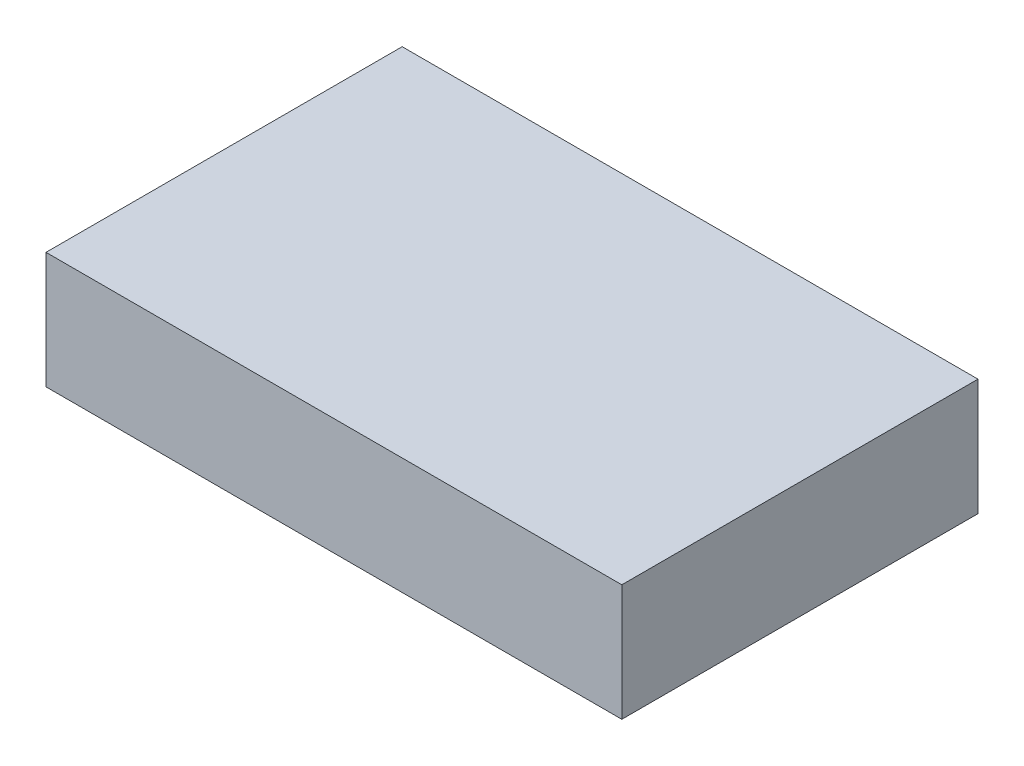
ISO-10303-21;
HEADER;
FILE_DESCRIPTION(('STEP AP214'),'2;1');
FILE_NAME('part.step','',(''),(''),'','','');
FILE_SCHEMA(('AUTOMOTIVE_DESIGN { 1 0 10303 214 1 1 1 1 }'));
ENDSEC;
DATA;
#1=APPLICATION_CONTEXT('core data for automotive mechanical design processes');
#2=APPLICATION_PROTOCOL_DEFINITION('international standard','automotive_design',2000,#1);
#3=PRODUCT_CONTEXT('',#1,'mechanical');
#4=PRODUCT('Part','Part','',(#3));
#5=PRODUCT_RELATED_PRODUCT_CATEGORY('part','',(#4));
#6=PRODUCT_DEFINITION_FORMATION('','',#4);
#7=PRODUCT_DEFINITION_CONTEXT('part definition',#1,'design');
#8=PRODUCT_DEFINITION('design','',#6,#7);
#9=PRODUCT_DEFINITION_SHAPE('','',#8);
#10=(LENGTH_UNIT() NAMED_UNIT(*) SI_UNIT(.MILLI.,.METRE.));
#11=(NAMED_UNIT(*) PLANE_ANGLE_UNIT() SI_UNIT($,.RADIAN.));
#12=(NAMED_UNIT(*) SI_UNIT($,.STERADIAN.) SOLID_ANGLE_UNIT());
#13=UNCERTAINTY_MEASURE_WITH_UNIT(LENGTH_MEASURE(1.E-05),#10,'distance_accuracy_value','');
#14=(GEOMETRIC_REPRESENTATION_CONTEXT(3) GLOBAL_UNCERTAINTY_ASSIGNED_CONTEXT((#13)) GLOBAL_UNIT_ASSIGNED_CONTEXT((#10,
#11,#12)) REPRESENTATION_CONTEXT('',''));
#15=CARTESIAN_POINT('',(0.,0.,0.));
#16=DIRECTION('',(0.,0.,1.));
#17=DIRECTION('',(1.,0.,0.));
#18=AXIS2_PLACEMENT_3D('',#15,#16,#17);
#19=CARTESIAN_POINT('',(0.,0.315,0.));
#20=DIRECTION('',(0.,1.,0.));
#21=DIRECTION('',(1.,0.,0.));
#22=AXIS2_PLACEMENT_3D('',#19,#20,#21);
#23=PLANE('',#22);
#24=DIRECTION('',(0.,0.,1.));
#25=VECTOR('',#24,1.);
#26=CARTESIAN_POINT('',(-0.06496203605977,0.315,-0.462376844896));
#27=LINE('',#26,#25);
#28=CARTESIAN_POINT('',(-0.06496203605977,0.315,-0.462376844896));
#29=VERTEX_POINT('',#28);
#30=CARTESIAN_POINT('',(-0.06496203605977,0.315,-0.156673145791));
#31=VERTEX_POINT('',#30);
#32=EDGE_CURVE('E97',#29,#31,#27,.T.);
#33=ORIENTED_EDGE('',*,*,#32,.F.);
#34=DIRECTION('',(-1.,0.,0.));
#35=VECTOR('',#34,1.);
#36=CARTESIAN_POINT('',(-0.06496203605977,0.315,-0.462376844896));
#37=LINE('',#36,#35);
#38=CARTESIAN_POINT('',(0.42925894416,0.315,-0.462376844896));
#39=VERTEX_POINT('',#38);
#40=EDGE_CURVE('E27',#39,#29,#37,.T.);
#41=ORIENTED_EDGE('',*,*,#40,.F.);
#42=DIRECTION('',(0.,0.,-1.));
#43=VECTOR('',#42,1.);
#44=CARTESIAN_POINT('',(0.42925894416,0.315,-0.462376844896));
#45=LINE('',#44,#43);
#46=CARTESIAN_POINT('',(0.42925894416,0.315,-0.156673145791));
#47=VERTEX_POINT('',#46);
#48=EDGE_CURVE('E73',#47,#39,#45,.T.);
#49=ORIENTED_EDGE('',*,*,#48,.F.);
#50=DIRECTION('',(1.,0.,0.));
#51=VECTOR('',#50,1.);
#52=CARTESIAN_POINT('',(-0.06496203605977,0.315,-0.156673145791));
#53=LINE('',#52,#51);
#54=EDGE_CURVE('E55',#31,#47,#53,.T.);
#55=ORIENTED_EDGE('',*,*,#54,.F.);
#56=EDGE_LOOP('',(#33,#41,#49,#55));
#57=FACE_BOUND('',#56,.T.);
#58=ADVANCED_FACE('F17',(#57),#23,.F.);
#59=CARTESIAN_POINT('',(0.,0.415,0.));
#60=DIRECTION('',(0.,1.,0.));
#61=DIRECTION('',(1.,0.,0.));
#62=AXIS2_PLACEMENT_3D('',#59,#60,#61);
#63=PLANE('',#62);
#64=DIRECTION('',(0.,0.,1.));
#65=VECTOR('',#64,1.);
#66=CARTESIAN_POINT('',(-0.06496203605977,0.415,-0.462376844896));
#67=LINE('',#66,#65);
#68=CARTESIAN_POINT('',(-0.06496203605977,0.415,-0.462376844896));
#69=VERTEX_POINT('',#68);
#70=CARTESIAN_POINT('',(-0.06496203605977,0.415,-0.156673145791));
#71=VERTEX_POINT('',#70);
#72=EDGE_CURVE('E20',#69,#71,#67,.T.);
#73=ORIENTED_EDGE('',*,*,#72,.T.);
#74=DIRECTION('',(1.,0.,0.));
#75=VECTOR('',#74,1.);
#76=CARTESIAN_POINT('',(-0.06496203605977,0.415,-0.156673145791));
#77=LINE('',#76,#75);
#78=CARTESIAN_POINT('',(0.42925894416,0.415,-0.156673145791));
#79=VERTEX_POINT('',#78);
#80=EDGE_CURVE('E107',#71,#79,#77,.T.);
#81=ORIENTED_EDGE('',*,*,#80,.T.);
#82=DIRECTION('',(0.,0.,-1.));
#83=VECTOR('',#82,1.);
#84=CARTESIAN_POINT('',(0.42925894416,0.415,-0.462376844896));
#85=LINE('',#84,#83);
#86=CARTESIAN_POINT('',(0.42925894416,0.415,-0.462376844896));
#87=VERTEX_POINT('',#86);
#88=EDGE_CURVE('E82',#79,#87,#85,.T.);
#89=ORIENTED_EDGE('',*,*,#88,.T.);
#90=DIRECTION('',(-1.,0.,0.));
#91=VECTOR('',#90,1.);
#92=CARTESIAN_POINT('',(-0.06496203605977,0.415,-0.462376844896));
#93=LINE('',#92,#91);
#94=EDGE_CURVE('E11',#87,#69,#93,.T.);
#95=ORIENTED_EDGE('',*,*,#94,.T.);
#96=EDGE_LOOP('',(#73,#81,#89,#95));
#97=FACE_BOUND('',#96,.T.);
#98=ADVANCED_FACE('F78',(#97),#63,.T.);
#99=CARTESIAN_POINT('',(-0.06496203605977,0.415,-0.462376844896));
#100=DIRECTION('',(0.,0.,1.));
#101=DIRECTION('',(1.,0.,0.));
#102=AXIS2_PLACEMENT_3D('',#99,#100,#101);
#103=PLANE('',#102);
#104=ORIENTED_EDGE('',*,*,#40,.T.);
#105=DIRECTION('',(0.,-1.,0.));
#106=VECTOR('',#105,1.);
#107=CARTESIAN_POINT('',(-0.06496203605977,0.415,-0.462376844896));
#108=LINE('',#107,#106);
#109=EDGE_CURVE('E84',#69,#29,#108,.T.);
#110=ORIENTED_EDGE('',*,*,#109,.F.);
#111=ORIENTED_EDGE('',*,*,#94,.F.);
#112=DIRECTION('',(0.,-1.,0.));
#113=VECTOR('',#112,1.);
#114=CARTESIAN_POINT('',(0.42925894416,0.415,-0.462376844896));
#115=LINE('',#114,#113);
#116=EDGE_CURVE('E110',#87,#39,#115,.T.);
#117=ORIENTED_EDGE('',*,*,#116,.T.);
#118=EDGE_LOOP('',(#104,#110,#111,#117));
#119=FACE_BOUND('',#118,.T.);
#120=ADVANCED_FACE('F85',(#119),#103,.F.);
#121=CARTESIAN_POINT('',(0.42925894416,0.415,-0.462376844896));
#122=DIRECTION('',(-1.,0.,0.));
#123=DIRECTION('',(0.,0.,1.));
#124=AXIS2_PLACEMENT_3D('',#121,#122,#123);
#125=PLANE('',#124);
#126=ORIENTED_EDGE('',*,*,#48,.T.);
#127=ORIENTED_EDGE('',*,*,#116,.F.);
#128=ORIENTED_EDGE('',*,*,#88,.F.);
#129=DIRECTION('',(0.,-1.,0.));
#130=VECTOR('',#129,1.);
#131=CARTESIAN_POINT('',(0.42925894416,0.415,-0.156673145791));
#132=LINE('',#131,#130);
#133=EDGE_CURVE('E105',#79,#47,#132,.T.);
#134=ORIENTED_EDGE('',*,*,#133,.T.);
#135=EDGE_LOOP('',(#126,#127,#128,#134));
#136=FACE_BOUND('',#135,.T.);
#137=ADVANCED_FACE('F120',(#136),#125,.F.);
#138=CARTESIAN_POINT('',(-0.06496203605977,0.415,-0.156673145791));
#139=DIRECTION('',(0.,0.,-1.));
#140=DIRECTION('',(0.,-1.,0.));
#141=AXIS2_PLACEMENT_3D('',#138,#139,#140);
#142=PLANE('',#141);
#143=ORIENTED_EDGE('',*,*,#54,.T.);
#144=ORIENTED_EDGE('',*,*,#133,.F.);
#145=ORIENTED_EDGE('',*,*,#80,.F.);
#146=DIRECTION('',(0.,-1.,0.));
#147=VECTOR('',#146,1.);
#148=CARTESIAN_POINT('',(-0.06496203605977,0.415,-0.156673145791));
#149=LINE('',#148,#147);
#150=EDGE_CURVE('E91',#71,#31,#149,.T.);
#151=ORIENTED_EDGE('',*,*,#150,.T.);
#152=EDGE_LOOP('',(#143,#144,#145,#151));
#153=FACE_BOUND('',#152,.T.);
#154=ADVANCED_FACE('F122',(#153),#142,.F.);
#155=CARTESIAN_POINT('',(-0.06496203605977,0.415,-0.462376844896));
#156=DIRECTION('',(1.,0.,0.));
#157=DIRECTION('',(0.,1.,0.));
#158=AXIS2_PLACEMENT_3D('',#155,#156,#157);
#159=PLANE('',#158);
#160=ORIENTED_EDGE('',*,*,#32,.T.);
#161=ORIENTED_EDGE('',*,*,#150,.F.);
#162=ORIENTED_EDGE('',*,*,#72,.F.);
#163=ORIENTED_EDGE('',*,*,#109,.T.);
#164=EDGE_LOOP('',(#160,#161,#162,#163));
#165=FACE_BOUND('',#164,.T.);
#166=ADVANCED_FACE('F90',(#165),#159,.F.);
#167=CLOSED_SHELL('',(#58,#98,#120,#137,#154,#166));
#168=MANIFOLD_SOLID_BREP('B1',#167);
#169=ADVANCED_BREP_SHAPE_REPRESENTATION('',(#18,#168),#14);
#170=SHAPE_DEFINITION_REPRESENTATION(#9,#169);
ENDSEC;
END-ISO-10303-21;
